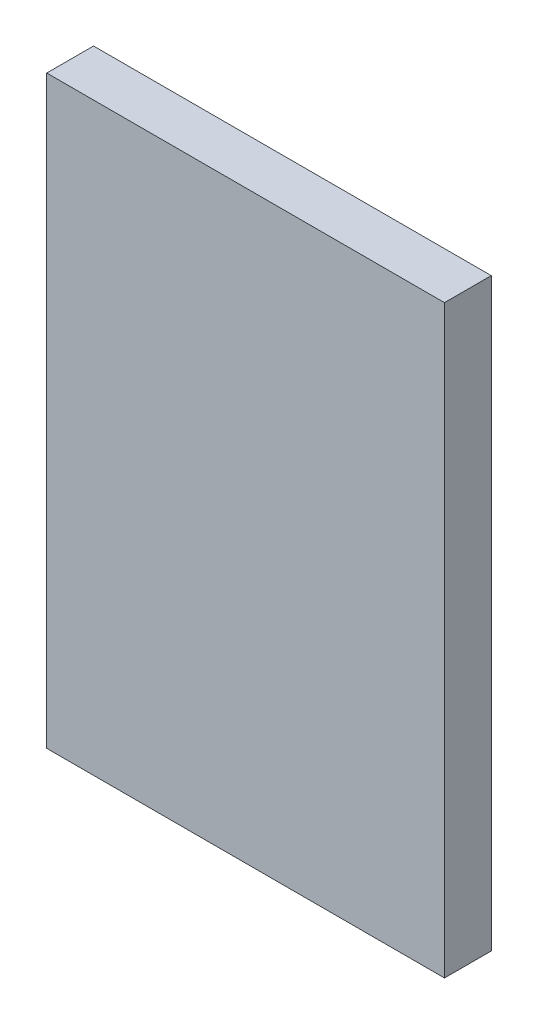
ISO-10303-21;
HEADER;
FILE_DESCRIPTION(('STEP AP214'),'2;1');
FILE_NAME('part.step','',(''),(''),'','','');
FILE_SCHEMA(('AUTOMOTIVE_DESIGN { 1 0 10303 214 1 1 1 1 }'));
ENDSEC;
DATA;
#1=APPLICATION_CONTEXT('core data for automotive mechanical design processes');
#2=APPLICATION_PROTOCOL_DEFINITION('international standard','automotive_design',2000,#1);
#3=PRODUCT_CONTEXT('',#1,'mechanical');
#4=PRODUCT('Part','Part','',(#3));
#5=PRODUCT_RELATED_PRODUCT_CATEGORY('part','',(#4));
#6=PRODUCT_DEFINITION_FORMATION('','',#4);
#7=PRODUCT_DEFINITION_CONTEXT('part definition',#1,'design');
#8=PRODUCT_DEFINITION('design','',#6,#7);
#9=PRODUCT_DEFINITION_SHAPE('','',#8);
#10=(LENGTH_UNIT() NAMED_UNIT(*) SI_UNIT(.MILLI.,.METRE.));
#11=(NAMED_UNIT(*) PLANE_ANGLE_UNIT() SI_UNIT($,.RADIAN.));
#12=(NAMED_UNIT(*) SI_UNIT($,.STERADIAN.) SOLID_ANGLE_UNIT());
#13=UNCERTAINTY_MEASURE_WITH_UNIT(LENGTH_MEASURE(1.E-05),#10,'distance_accuracy_value','');
#14=(GEOMETRIC_REPRESENTATION_CONTEXT(3) GLOBAL_UNCERTAINTY_ASSIGNED_CONTEXT((#13)) GLOBAL_UNIT_ASSIGNED_CONTEXT((#10,
#11,#12)) REPRESENTATION_CONTEXT('',''));
#15=CARTESIAN_POINT('',(0.,0.,0.));
#16=DIRECTION('',(0.,0.,1.));
#17=DIRECTION('',(1.,0.,0.));
#18=AXIS2_PLACEMENT_3D('',#15,#16,#17);
#19=CARTESIAN_POINT('',(195.,-105.,-90.));
#20=DIRECTION('',(0.,0.,1.));
#21=DIRECTION('',(1.,0.,0.));
#22=AXIS2_PLACEMENT_3D('',#19,#20,#21);
#23=PLANE('',#22);
#24=DIRECTION('',(0.,1.,0.));
#25=VECTOR('',#24,1.);
#26=CARTESIAN_POINT('',(195.,-105.,-90.));
#27=LINE('',#26,#25);
#28=CARTESIAN_POINT('',(195.,-105.,-90.));
#29=VERTEX_POINT('',#28);
#30=CARTESIAN_POINT('',(195.,145.,-90.));
#31=VERTEX_POINT('',#30);
#32=EDGE_CURVE('E88',#29,#31,#27,.T.);
#33=ORIENTED_EDGE('',*,*,#32,.F.);
#34=DIRECTION('',(1.,0.,0.));
#35=VECTOR('',#34,1.);
#36=CARTESIAN_POINT('',(195.,-105.,-90.));
#37=LINE('',#36,#35);
#38=CARTESIAN_POINT('',(365.,-105.,-90.));
#39=VERTEX_POINT('',#38);
#40=EDGE_CURVE('E69',#29,#39,#37,.T.);
#41=ORIENTED_EDGE('',*,*,#40,.T.);
#42=DIRECTION('',(0.,1.,0.));
#43=VECTOR('',#42,1.);
#44=CARTESIAN_POINT('',(365.,-105.,-90.));
#45=LINE('',#44,#43);
#46=CARTESIAN_POINT('',(365.,145.,-90.));
#47=VERTEX_POINT('',#46);
#48=EDGE_CURVE('E81',#39,#47,#45,.T.);
#49=ORIENTED_EDGE('',*,*,#48,.T.);
#50=DIRECTION('',(1.,0.,0.));
#51=VECTOR('',#50,1.);
#52=CARTESIAN_POINT('',(195.,145.,-90.));
#53=LINE('',#52,#51);
#54=EDGE_CURVE('E9',#31,#47,#53,.T.);
#55=ORIENTED_EDGE('',*,*,#54,.F.);
#56=EDGE_LOOP('',(#33,#41,#49,#55));
#57=FACE_BOUND('',#56,.T.);
#58=ADVANCED_FACE('F15',(#57),#23,.T.);
#59=CARTESIAN_POINT('',(195.,-105.,-110.));
#60=DIRECTION('',(0.,0.,1.));
#61=DIRECTION('',(1.,0.,0.));
#62=AXIS2_PLACEMENT_3D('',#59,#60,#61);
#63=PLANE('',#62);
#64=DIRECTION('',(1.,0.,0.));
#65=VECTOR('',#64,1.);
#66=CARTESIAN_POINT('',(195.,145.,-110.));
#67=LINE('',#66,#65);
#68=CARTESIAN_POINT('',(195.,145.,-110.));
#69=VERTEX_POINT('',#68);
#70=CARTESIAN_POINT('',(365.,145.,-110.));
#71=VERTEX_POINT('',#70);
#72=EDGE_CURVE('E24',#69,#71,#67,.T.);
#73=ORIENTED_EDGE('',*,*,#72,.T.);
#74=DIRECTION('',(0.,1.,0.));
#75=VECTOR('',#74,1.);
#76=CARTESIAN_POINT('',(365.,-105.,-110.));
#77=LINE('',#76,#75);
#78=CARTESIAN_POINT('',(365.,-105.,-110.));
#79=VERTEX_POINT('',#78);
#80=EDGE_CURVE('E98',#79,#71,#77,.T.);
#81=ORIENTED_EDGE('',*,*,#80,.F.);
#82=DIRECTION('',(1.,0.,0.));
#83=VECTOR('',#82,1.);
#84=CARTESIAN_POINT('',(195.,-105.,-110.));
#85=LINE('',#84,#83);
#86=CARTESIAN_POINT('',(195.,-105.,-110.));
#87=VERTEX_POINT('',#86);
#88=EDGE_CURVE('E18',#87,#79,#85,.T.);
#89=ORIENTED_EDGE('',*,*,#88,.F.);
#90=DIRECTION('',(0.,1.,0.));
#91=VECTOR('',#90,1.);
#92=CARTESIAN_POINT('',(195.,-105.,-110.));
#93=LINE('',#92,#91);
#94=EDGE_CURVE('E87',#87,#69,#93,.T.);
#95=ORIENTED_EDGE('',*,*,#94,.T.);
#96=EDGE_LOOP('',(#73,#81,#89,#95));
#97=FACE_BOUND('',#96,.T.);
#98=ADVANCED_FACE('F116',(#97),#63,.F.);
#99=CARTESIAN_POINT('',(195.,145.,-110.));
#100=DIRECTION('',(0.,1.,0.));
#101=DIRECTION('',(1.,0.,0.));
#102=AXIS2_PLACEMENT_3D('',#99,#100,#101);
#103=PLANE('',#102);
#104=ORIENTED_EDGE('',*,*,#72,.F.);
#105=DIRECTION('',(0.,0.,1.));
#106=VECTOR('',#105,1.);
#107=CARTESIAN_POINT('',(195.,145.,-110.));
#108=LINE('',#107,#106);
#109=EDGE_CURVE('E93',#69,#31,#108,.T.);
#110=ORIENTED_EDGE('',*,*,#109,.T.);
#111=ORIENTED_EDGE('',*,*,#54,.T.);
#112=DIRECTION('',(0.,0.,1.));
#113=VECTOR('',#112,1.);
#114=CARTESIAN_POINT('',(365.,145.,-110.));
#115=LINE('',#114,#113);
#116=EDGE_CURVE('E106',#71,#47,#115,.T.);
#117=ORIENTED_EDGE('',*,*,#116,.F.);
#118=EDGE_LOOP('',(#104,#110,#111,#117));
#119=FACE_BOUND('',#118,.T.);
#120=ADVANCED_FACE('F118',(#119),#103,.T.);
#121=CARTESIAN_POINT('',(195.,-105.,-110.));
#122=DIRECTION('',(0.,1.,0.));
#123=DIRECTION('',(1.,0.,0.));
#124=AXIS2_PLACEMENT_3D('',#121,#122,#123);
#125=PLANE('',#124);
#126=DIRECTION('',(0.,0.,1.));
#127=VECTOR('',#126,1.);
#128=CARTESIAN_POINT('',(365.,-105.,-110.));
#129=LINE('',#128,#127);
#130=EDGE_CURVE('E76',#79,#39,#129,.T.);
#131=ORIENTED_EDGE('',*,*,#130,.T.);
#132=ORIENTED_EDGE('',*,*,#40,.F.);
#133=DIRECTION('',(0.,0.,1.));
#134=VECTOR('',#133,1.);
#135=CARTESIAN_POINT('',(195.,-105.,-110.));
#136=LINE('',#135,#134);
#137=EDGE_CURVE('E73',#87,#29,#136,.T.);
#138=ORIENTED_EDGE('',*,*,#137,.F.);
#139=ORIENTED_EDGE('',*,*,#88,.T.);
#140=EDGE_LOOP('',(#131,#132,#138,#139));
#141=FACE_BOUND('',#140,.T.);
#142=ADVANCED_FACE('F71',(#141),#125,.F.);
#143=CARTESIAN_POINT('',(365.,-105.,-110.));
#144=DIRECTION('',(1.,0.,0.));
#145=DIRECTION('',(0.,1.,0.));
#146=AXIS2_PLACEMENT_3D('',#143,#144,#145);
#147=PLANE('',#146);
#148=ORIENTED_EDGE('',*,*,#130,.F.);
#149=ORIENTED_EDGE('',*,*,#80,.T.);
#150=ORIENTED_EDGE('',*,*,#116,.T.);
#151=ORIENTED_EDGE('',*,*,#48,.F.);
#152=EDGE_LOOP('',(#148,#149,#150,#151));
#153=FACE_BOUND('',#152,.T.);
#154=ADVANCED_FACE('F119',(#153),#147,.T.);
#155=CARTESIAN_POINT('',(195.,-105.,-110.));
#156=DIRECTION('',(1.,0.,0.));
#157=DIRECTION('',(0.,1.,0.));
#158=AXIS2_PLACEMENT_3D('',#155,#156,#157);
#159=PLANE('',#158);
#160=ORIENTED_EDGE('',*,*,#32,.T.);
#161=ORIENTED_EDGE('',*,*,#109,.F.);
#162=ORIENTED_EDGE('',*,*,#94,.F.);
#163=ORIENTED_EDGE('',*,*,#137,.T.);
#164=EDGE_LOOP('',(#160,#161,#162,#163));
#165=FACE_BOUND('',#164,.T.);
#166=ADVANCED_FACE('F82',(#165),#159,.F.);
#167=CLOSED_SHELL('',(#58,#98,#120,#142,#154,#166));
#168=MANIFOLD_SOLID_BREP('B1',#167);
#169=ADVANCED_BREP_SHAPE_REPRESENTATION('',(#18,#168),#14);
#170=SHAPE_DEFINITION_REPRESENTATION(#9,#169);
ENDSEC;
END-ISO-10303-21;
